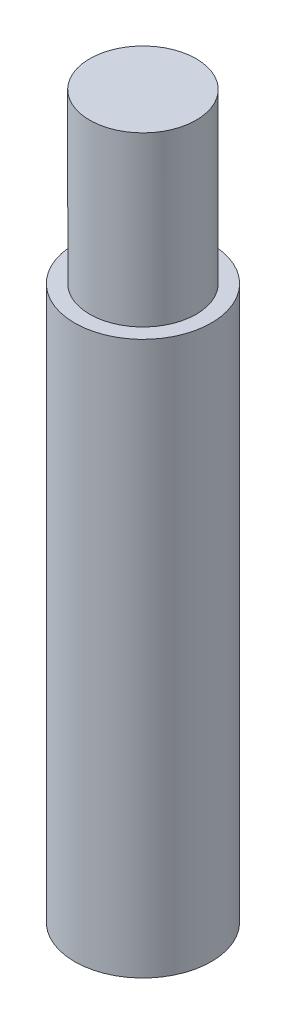
ISO-10303-21;
HEADER;
FILE_DESCRIPTION(('STEP AP214'),'2;1');
FILE_NAME('part.step','',(''),(''),'','','');
FILE_SCHEMA(('AUTOMOTIVE_DESIGN { 1 0 10303 214 1 1 1 1 }'));
ENDSEC;
DATA;
#1=APPLICATION_CONTEXT('core data for automotive mechanical design processes');
#2=APPLICATION_PROTOCOL_DEFINITION('international standard','automotive_design',2000,#1);
#3=PRODUCT_CONTEXT('',#1,'mechanical');
#4=PRODUCT('Part','Part','',(#3));
#5=PRODUCT_RELATED_PRODUCT_CATEGORY('part','',(#4));
#6=PRODUCT_DEFINITION_FORMATION('','',#4);
#7=PRODUCT_DEFINITION_CONTEXT('part definition',#1,'design');
#8=PRODUCT_DEFINITION('design','',#6,#7);
#9=PRODUCT_DEFINITION_SHAPE('','',#8);
#10=(LENGTH_UNIT() NAMED_UNIT(*) SI_UNIT(.MILLI.,.METRE.));
#11=(NAMED_UNIT(*) PLANE_ANGLE_UNIT() SI_UNIT($,.RADIAN.));
#12=(NAMED_UNIT(*) SI_UNIT($,.STERADIAN.) SOLID_ANGLE_UNIT());
#13=UNCERTAINTY_MEASURE_WITH_UNIT(LENGTH_MEASURE(1.E-05),#10,'distance_accuracy_value','');
#14=(GEOMETRIC_REPRESENTATION_CONTEXT(3) GLOBAL_UNCERTAINTY_ASSIGNED_CONTEXT((#13)) GLOBAL_UNIT_ASSIGNED_CONTEXT((#10,
#11,#12)) REPRESENTATION_CONTEXT('',''));
#15=CARTESIAN_POINT('',(0.,0.,0.));
#16=DIRECTION('',(0.,0.,1.));
#17=DIRECTION('',(1.,0.,0.));
#18=AXIS2_PLACEMENT_3D('',#15,#16,#17);
#19=CARTESIAN_POINT('',(0.,98.7,0.));
#20=DIRECTION('',(0.,-1.,0.));
#21=DIRECTION('',(0.,0.,-1.));
#22=AXIS2_PLACEMENT_3D('',#19,#20,#21);
#23=CYLINDRICAL_SURFACE('',#22,12.2);
#24=CARTESIAN_POINT('',(0.,98.7,0.));
#25=DIRECTION('',(0.,1.,0.));
#26=DIRECTION('',(0.,0.,1.));
#27=AXIS2_PLACEMENT_3D('',#24,#25,#26);
#28=CIRCLE('',#27,12.2);
#29=CARTESIAN_POINT('',(0.,98.7,12.2));
#30=VERTEX_POINT('',#29);
#31=EDGE_CURVE('E44',#30,#30,#28,.T.);
#32=ORIENTED_EDGE('',*,*,#31,.F.);
#33=EDGE_LOOP('',(#32));
#34=FACE_BOUND('',#33,.T.);
#35=CARTESIAN_POINT('',(0.,0.,0.));
#36=DIRECTION('',(0.,1.,0.));
#37=DIRECTION('',(0.,0.,1.));
#38=AXIS2_PLACEMENT_3D('',#35,#36,#37);
#39=CIRCLE('',#38,12.2);
#40=CARTESIAN_POINT('',(0.,0.,12.2));
#41=VERTEX_POINT('',#40);
#42=EDGE_CURVE('E40',#41,#41,#39,.T.);
#43=ORIENTED_EDGE('',*,*,#42,.T.);
#44=EDGE_LOOP('',(#43));
#45=FACE_BOUND('',#44,.T.);
#46=ADVANCED_FACE('F37',(#34,#45),#23,.T.);
#47=CARTESIAN_POINT('',(0.,98.7,0.));
#48=DIRECTION('',(0.,1.,0.));
#49=DIRECTION('',(0.,0.,1.));
#50=AXIS2_PLACEMENT_3D('',#47,#48,#49);
#51=PLANE('',#50);
#52=CARTESIAN_POINT('',(0.,98.7,0.));
#53=DIRECTION('',(0.,1.,0.));
#54=DIRECTION('',(0.,0.,1.));
#55=AXIS2_PLACEMENT_3D('',#52,#53,#54);
#56=CIRCLE('',#55,9.5);
#57=CARTESIAN_POINT('',(0.,98.7,9.5));
#58=VERTEX_POINT('',#57);
#59=EDGE_CURVE('E10',#58,#58,#56,.T.);
#60=ORIENTED_EDGE('',*,*,#59,.F.);
#61=EDGE_LOOP('',(#60));
#62=FACE_BOUND('',#61,.T.);
#63=ORIENTED_EDGE('',*,*,#31,.T.);
#64=EDGE_LOOP('',(#63));
#65=FACE_BOUND('',#64,.T.);
#66=ADVANCED_FACE('F61',(#62,#65),#51,.T.);
#67=CARTESIAN_POINT('',(0.,0.,0.));
#68=DIRECTION('',(0.,1.,0.));
#69=DIRECTION('',(0.,0.,1.));
#70=AXIS2_PLACEMENT_3D('',#67,#68,#69);
#71=PLANE('',#70);
#72=ORIENTED_EDGE('',*,*,#42,.F.);
#73=EDGE_LOOP('',(#72));
#74=FACE_BOUND('',#73,.T.);
#75=ADVANCED_FACE('F58',(#74),#71,.F.);
#76=CARTESIAN_POINT('',(0.,155.570057685089,0.));
#77=DIRECTION('',(0.,-1.,0.));
#78=DIRECTION('',(0.,0.,-1.));
#79=AXIS2_PLACEMENT_3D('',#76,#77,#78);
#80=CYLINDRICAL_SURFACE('',#79,9.5);
#81=CARTESIAN_POINT('',(0.,128.7,0.));
#82=DIRECTION('',(0.,-1.,0.));
#83=DIRECTION('',(0.,0.,-1.));
#84=AXIS2_PLACEMENT_3D('',#81,#82,#83);
#85=CIRCLE('',#84,9.5);
#86=CARTESIAN_POINT('',(0.,128.7,-9.5));
#87=VERTEX_POINT('',#86);
#88=EDGE_CURVE('E50',#87,#87,#85,.T.);
#89=ORIENTED_EDGE('',*,*,#88,.T.);
#90=EDGE_LOOP('',(#89));
#91=FACE_BOUND('',#90,.T.);
#92=ORIENTED_EDGE('',*,*,#59,.T.);
#93=EDGE_LOOP('',(#92));
#94=FACE_BOUND('',#93,.T.);
#95=ADVANCED_FACE('F60',(#91,#94),#80,.T.);
#96=CARTESIAN_POINT('',(-2.54098579237938,128.7,47.3686963215468));
#97=DIRECTION('',(0.,-1.,0.));
#98=DIRECTION('',(-0.81322195985166,0.,-0.58195364421492));
#99=AXIS2_PLACEMENT_3D('',#96,#97,#98);
#100=PLANE('',#99);
#101=ORIENTED_EDGE('',*,*,#88,.F.);
#102=EDGE_LOOP('',(#101));
#103=FACE_BOUND('',#102,.T.);
#104=ADVANCED_FACE('F67',(#103),#100,.F.);
#105=CLOSED_SHELL('',(#46,#66,#75,#95,#104));
#106=MANIFOLD_SOLID_BREP('B2',#105);
#107=ADVANCED_BREP_SHAPE_REPRESENTATION('',(#18,#106),#14);
#108=SHAPE_DEFINITION_REPRESENTATION(#9,#107);
ENDSEC;
END-ISO-10303-21;
